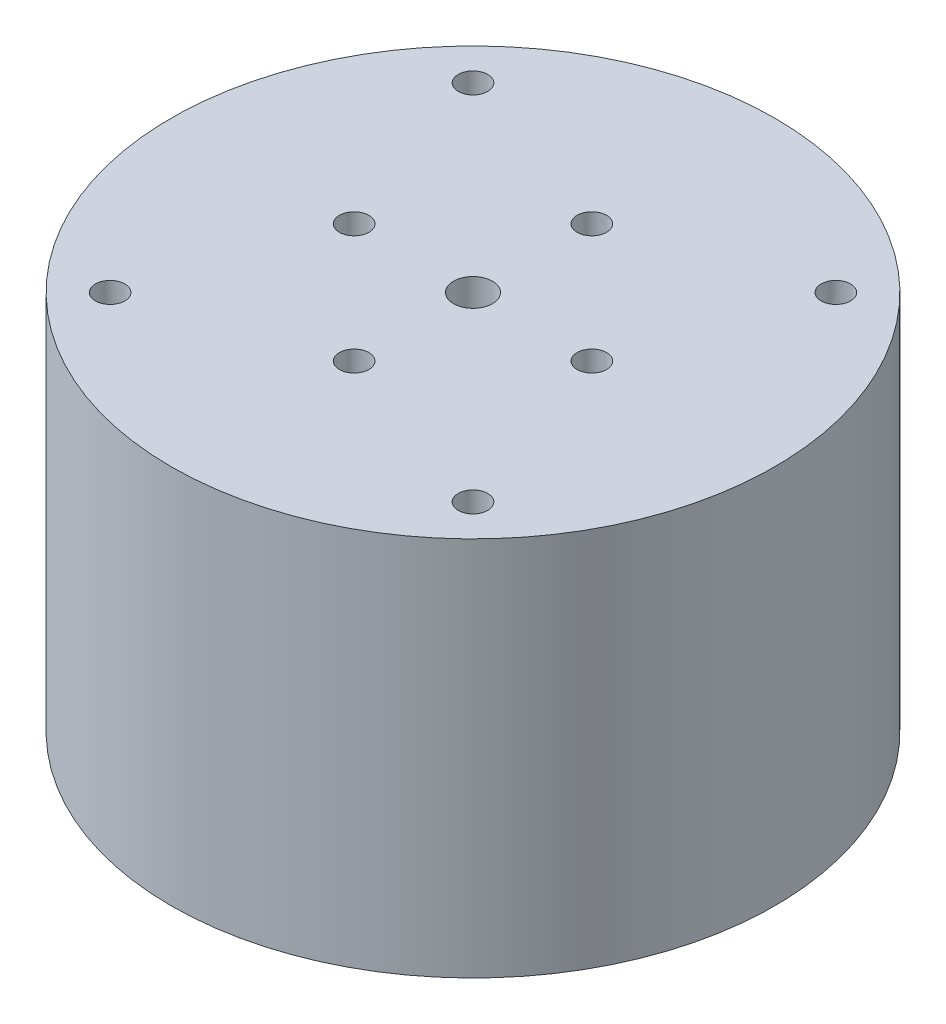
ISO-10303-21;
HEADER;
FILE_DESCRIPTION(('STEP AP214'),'2;1');
FILE_NAME('part.step','',(''),(''),'','','');
FILE_SCHEMA(('AUTOMOTIVE_DESIGN { 1 0 10303 214 1 1 1 1 }'));
ENDSEC;
DATA;
#1=APPLICATION_CONTEXT('core data for automotive mechanical design processes');
#2=APPLICATION_PROTOCOL_DEFINITION('international standard','automotive_design',2000,#1);
#3=PRODUCT_CONTEXT('',#1,'mechanical');
#4=PRODUCT('Part','Part','',(#3));
#5=PRODUCT_RELATED_PRODUCT_CATEGORY('part','',(#4));
#6=PRODUCT_DEFINITION_FORMATION('','',#4);
#7=PRODUCT_DEFINITION_CONTEXT('part definition',#1,'design');
#8=PRODUCT_DEFINITION('design','',#6,#7);
#9=PRODUCT_DEFINITION_SHAPE('','',#8);
#10=(LENGTH_UNIT() NAMED_UNIT(*) SI_UNIT(.MILLI.,.METRE.));
#11=(NAMED_UNIT(*) PLANE_ANGLE_UNIT() SI_UNIT($,.RADIAN.));
#12=(NAMED_UNIT(*) SI_UNIT($,.STERADIAN.) SOLID_ANGLE_UNIT());
#13=UNCERTAINTY_MEASURE_WITH_UNIT(LENGTH_MEASURE(1.E-05),#10,'distance_accuracy_value','');
#14=(GEOMETRIC_REPRESENTATION_CONTEXT(3) GLOBAL_UNCERTAINTY_ASSIGNED_CONTEXT((#13)) GLOBAL_UNIT_ASSIGNED_CONTEXT((#10,
#11,#12)) REPRESENTATION_CONTEXT('',''));
#15=CARTESIAN_POINT('',(0.,0.,0.));
#16=DIRECTION('',(0.,0.,1.));
#17=DIRECTION('',(1.,0.,0.));
#18=AXIS2_PLACEMENT_3D('',#15,#16,#17);
#19=CARTESIAN_POINT('',(0.,40.,0.));
#20=DIRECTION('',(0.,-1.,0.));
#21=DIRECTION('',(0.,0.,-1.));
#22=AXIS2_PLACEMENT_3D('',#19,#20,#21);
#23=CYLINDRICAL_SURFACE('',#22,2.05);
#24=CARTESIAN_POINT('',(0.,40.,0.));
#25=DIRECTION('',(0.,1.,0.));
#26=DIRECTION('',(0.,0.,1.));
#27=AXIS2_PLACEMENT_3D('',#24,#25,#26);
#28=CIRCLE('',#27,2.05);
#29=CARTESIAN_POINT('',(0.,40.,2.05));
#30=VERTEX_POINT('',#29);
#31=EDGE_CURVE('E44',#30,#30,#28,.T.);
#32=ORIENTED_EDGE('',*,*,#31,.T.);
#33=EDGE_LOOP('',(#32));
#34=FACE_BOUND('',#33,.T.);
#35=CARTESIAN_POINT('',(0.,30.,0.));
#36=DIRECTION('',(0.,-1.,0.));
#37=DIRECTION('',(0.,0.,-1.));
#38=AXIS2_PLACEMENT_3D('',#35,#36,#37);
#39=CIRCLE('',#38,2.05);
#40=CARTESIAN_POINT('',(0.,30.,-2.05));
#41=VERTEX_POINT('',#40);
#42=EDGE_CURVE('E35',#41,#41,#39,.T.);
#43=ORIENTED_EDGE('',*,*,#42,.T.);
#44=EDGE_LOOP('',(#43));
#45=FACE_BOUND('',#44,.T.);
#46=ADVANCED_FACE('F31',(#34,#45),#23,.F.);
#47=CARTESIAN_POINT('',(0.,40.,0.));
#48=DIRECTION('',(0.,1.,0.));
#49=DIRECTION('',(0.,0.,1.));
#50=AXIS2_PLACEMENT_3D('',#47,#48,#49);
#51=PLANE('',#50);
#52=CARTESIAN_POINT('',(-19.0830442572703,40.,19.0830442572725));
#53=DIRECTION('',(0.,1.,0.));
#54=DIRECTION('',(0.,0.,1.));
#55=AXIS2_PLACEMENT_3D('',#52,#53,#54);
#56=CIRCLE('',#55,1.55000000000235);
#57=CARTESIAN_POINT('',(-19.0830442572703,40.,20.6330442572748));
#58=VERTEX_POINT('',#57);
#59=EDGE_CURVE('E82',#58,#58,#56,.T.);
#60=ORIENTED_EDGE('',*,*,#59,.F.);
#61=EDGE_LOOP('',(#60));
#62=FACE_BOUND('',#61,.T.);
#63=CARTESIAN_POINT('',(19.0830442572726,40.,-19.0830442572725));
#64=DIRECTION('',(0.,1.,0.));
#65=DIRECTION('',(0.,0.,1.));
#66=AXIS2_PLACEMENT_3D('',#63,#64,#65);
#67=CIRCLE('',#66,1.55000000000013);
#68=CARTESIAN_POINT('',(19.0830442572726,40.,-17.5330442572723));
#69=VERTEX_POINT('',#68);
#70=EDGE_CURVE('E70',#69,#69,#67,.T.);
#71=ORIENTED_EDGE('',*,*,#70,.F.);
#72=EDGE_LOOP('',(#71));
#73=FACE_BOUND('',#72,.T.);
#74=CARTESIAN_POINT('',(7.07481118762232E-13,40.,12.5));
#75=DIRECTION('',(0.,1.,0.));
#76=DIRECTION('',(0.,0.,1.));
#77=AXIS2_PLACEMENT_3D('',#74,#75,#76);
#78=CIRCLE('',#77,1.55000000000076);
#79=CARTESIAN_POINT('',(7.07481118762232E-13,40.,14.0500000000008));
#80=VERTEX_POINT('',#79);
#81=EDGE_CURVE('E58',#80,#80,#78,.T.);
#82=ORIENTED_EDGE('',*,*,#81,.F.);
#83=EDGE_LOOP('',(#82));
#84=FACE_BOUND('',#83,.T.);
#85=CARTESIAN_POINT('',(0.,40.,-12.5));
#86=DIRECTION('',(0.,1.,0.));
#87=DIRECTION('',(0.,0.,1.));
#88=AXIS2_PLACEMENT_3D('',#85,#86,#87);
#89=CIRCLE('',#88,1.55);
#90=CARTESIAN_POINT('',(0.,40.,-10.95));
#91=VERTEX_POINT('',#90);
#92=EDGE_CURVE('E48',#91,#91,#89,.T.);
#93=ORIENTED_EDGE('',*,*,#92,.F.);
#94=EDGE_LOOP('',(#93));
#95=FACE_BOUND('',#94,.T.);
#96=CARTESIAN_POINT('',(0.,40.,0.));
#97=DIRECTION('',(0.,1.,0.));
#98=DIRECTION('',(0.,0.,1.));
#99=AXIS2_PLACEMENT_3D('',#96,#97,#98);
#100=CIRCLE('',#99,31.75);
#101=CARTESIAN_POINT('',(0.,40.,31.75));
#102=VERTEX_POINT('',#101);
#103=EDGE_CURVE('E10',#102,#102,#100,.T.);
#104=ORIENTED_EDGE('',*,*,#103,.T.);
#105=EDGE_LOOP('',(#104));
#106=FACE_BOUND('',#105,.T.);
#107=ORIENTED_EDGE('',*,*,#31,.F.);
#108=EDGE_LOOP('',(#107));
#109=FACE_BOUND('',#108,.T.);
#110=CARTESIAN_POINT('',(12.5000000000004,40.,-3.53740559381116E-13));
#111=DIRECTION('',(0.,1.,0.));
#112=DIRECTION('',(0.,0.,1.));
#113=AXIS2_PLACEMENT_3D('',#110,#111,#112);
#114=CIRCLE('',#113,1.55000000000028);
#115=CARTESIAN_POINT('',(12.5000000000004,40.,1.54999999999992));
#116=VERTEX_POINT('',#115);
#117=EDGE_CURVE('E52',#116,#116,#114,.T.);
#118=ORIENTED_EDGE('',*,*,#117,.F.);
#119=EDGE_LOOP('',(#118));
#120=FACE_BOUND('',#119,.T.);
#121=CARTESIAN_POINT('',(-12.4999999999996,40.,3.5527136788005E-13));
#122=DIRECTION('',(0.,1.,0.));
#123=DIRECTION('',(0.,0.,1.));
#124=AXIS2_PLACEMENT_3D('',#121,#122,#123);
#125=CIRCLE('',#124,1.55000000000057);
#126=CARTESIAN_POINT('',(-12.4999999999996,40.,1.55000000000092));
#127=VERTEX_POINT('',#126);
#128=EDGE_CURVE('E64',#127,#127,#125,.T.);
#129=ORIENTED_EDGE('',*,*,#128,.F.);
#130=EDGE_LOOP('',(#129));
#131=FACE_BOUND('',#130,.T.);
#132=CARTESIAN_POINT('',(19.0830442572736,40.,19.0830442572714));
#133=DIRECTION('',(0.,1.,0.));
#134=DIRECTION('',(0.,0.,1.));
#135=AXIS2_PLACEMENT_3D('',#132,#133,#134);
#136=CIRCLE('',#135,1.55000000000178);
#137=CARTESIAN_POINT('',(19.0830442572736,40.,20.6330442572732));
#138=VERTEX_POINT('',#137);
#139=EDGE_CURVE('E76',#138,#138,#136,.T.);
#140=ORIENTED_EDGE('',*,*,#139,.F.);
#141=EDGE_LOOP('',(#140));
#142=FACE_BOUND('',#141,.T.);
#143=CARTESIAN_POINT('',(-19.0830442572713,40.,-19.0830442572714));
#144=DIRECTION('',(0.,1.,0.));
#145=DIRECTION('',(0.,0.,1.));
#146=AXIS2_PLACEMENT_3D('',#143,#144,#145);
#147=CIRCLE('',#146,1.55000000000088);
#148=CARTESIAN_POINT('',(-19.0830442572713,40.,-17.5330442572706));
#149=VERTEX_POINT('',#148);
#150=EDGE_CURVE('E88',#149,#149,#147,.T.);
#151=ORIENTED_EDGE('',*,*,#150,.F.);
#152=EDGE_LOOP('',(#151));
#153=FACE_BOUND('',#152,.T.);
#154=ADVANCED_FACE('F118',(#62,#73,#84,#95,#106,#109,#120,#131,#142,#153),#51,.T.);
#155=CARTESIAN_POINT('',(0.,0.,0.));
#156=DIRECTION('',(0.,1.,0.));
#157=DIRECTION('',(0.,0.,1.));
#158=AXIS2_PLACEMENT_3D('',#155,#156,#157);
#159=PLANE('',#158);
#160=CARTESIAN_POINT('',(0.,0.,0.));
#161=DIRECTION('',(0.,-1.,0.));
#162=DIRECTION('',(0.,0.,-1.));
#163=AXIS2_PLACEMENT_3D('',#160,#161,#162);
#164=CIRCLE('',#163,6.5);
#165=CARTESIAN_POINT('',(0.,0.,-6.5));
#166=VERTEX_POINT('',#165);
#167=EDGE_CURVE('E96',#166,#166,#164,.T.);
#168=ORIENTED_EDGE('',*,*,#167,.F.);
#169=EDGE_LOOP('',(#168));
#170=FACE_BOUND('',#169,.T.);
#171=CARTESIAN_POINT('',(-19.0830442572703,0.,19.0830442572725));
#172=DIRECTION('',(0.,1.,0.));
#173=DIRECTION('',(0.,0.,1.));
#174=AXIS2_PLACEMENT_3D('',#171,#172,#173);
#175=CIRCLE('',#174,1.55000000000235);
#176=CARTESIAN_POINT('',(-19.0830442572703,0.,20.6330442572748));
#177=VERTEX_POINT('',#176);
#178=EDGE_CURVE('E85',#177,#177,#175,.T.);
#179=ORIENTED_EDGE('',*,*,#178,.T.);
#180=EDGE_LOOP('',(#179));
#181=FACE_BOUND('',#180,.T.);
#182=CARTESIAN_POINT('',(19.0830442572726,0.,-19.0830442572725));
#183=DIRECTION('',(0.,1.,0.));
#184=DIRECTION('',(0.,0.,1.));
#185=AXIS2_PLACEMENT_3D('',#182,#183,#184);
#186=CIRCLE('',#185,1.55000000000013);
#187=CARTESIAN_POINT('',(19.0830442572726,0.,-17.5330442572723));
#188=VERTEX_POINT('',#187);
#189=EDGE_CURVE('E73',#188,#188,#186,.T.);
#190=ORIENTED_EDGE('',*,*,#189,.T.);
#191=EDGE_LOOP('',(#190));
#192=FACE_BOUND('',#191,.T.);
#193=CARTESIAN_POINT('',(7.07481118762232E-13,0.,12.5));
#194=DIRECTION('',(0.,1.,0.));
#195=DIRECTION('',(0.,0.,1.));
#196=AXIS2_PLACEMENT_3D('',#193,#194,#195);
#197=CIRCLE('',#196,1.55000000000076);
#198=CARTESIAN_POINT('',(7.07481118762232E-13,0.,14.0500000000008));
#199=VERTEX_POINT('',#198);
#200=EDGE_CURVE('E61',#199,#199,#197,.T.);
#201=ORIENTED_EDGE('',*,*,#200,.T.);
#202=EDGE_LOOP('',(#201));
#203=FACE_BOUND('',#202,.T.);
#204=CARTESIAN_POINT('',(0.,0.,-12.5));
#205=DIRECTION('',(0.,1.,0.));
#206=DIRECTION('',(0.,0.,1.));
#207=AXIS2_PLACEMENT_3D('',#204,#205,#206);
#208=CIRCLE('',#207,1.55);
#209=CARTESIAN_POINT('',(0.,0.,-10.95));
#210=VERTEX_POINT('',#209);
#211=EDGE_CURVE('E49',#210,#210,#208,.T.);
#212=ORIENTED_EDGE('',*,*,#211,.T.);
#213=EDGE_LOOP('',(#212));
#214=FACE_BOUND('',#213,.T.);
#215=CARTESIAN_POINT('',(0.,0.,0.));
#216=DIRECTION('',(0.,1.,0.));
#217=DIRECTION('',(0.,0.,1.));
#218=AXIS2_PLACEMENT_3D('',#215,#216,#217);
#219=CIRCLE('',#218,31.75);
#220=CARTESIAN_POINT('',(0.,0.,31.75));
#221=VERTEX_POINT('',#220);
#222=EDGE_CURVE('E39',#221,#221,#219,.T.);
#223=ORIENTED_EDGE('',*,*,#222,.F.);
#224=EDGE_LOOP('',(#223));
#225=FACE_BOUND('',#224,.T.);
#226=CARTESIAN_POINT('',(12.5000000000004,0.,-3.53740559381116E-13));
#227=DIRECTION('',(0.,1.,0.));
#228=DIRECTION('',(0.,0.,1.));
#229=AXIS2_PLACEMENT_3D('',#226,#227,#228);
#230=CIRCLE('',#229,1.55000000000028);
#231=CARTESIAN_POINT('',(12.5000000000004,0.,1.54999999999992));
#232=VERTEX_POINT('',#231);
#233=EDGE_CURVE('E55',#232,#232,#230,.T.);
#234=ORIENTED_EDGE('',*,*,#233,.T.);
#235=EDGE_LOOP('',(#234));
#236=FACE_BOUND('',#235,.T.);
#237=CARTESIAN_POINT('',(-12.4999999999996,0.,3.5527136788005E-13));
#238=DIRECTION('',(0.,1.,0.));
#239=DIRECTION('',(0.,0.,1.));
#240=AXIS2_PLACEMENT_3D('',#237,#238,#239);
#241=CIRCLE('',#240,1.55000000000057);
#242=CARTESIAN_POINT('',(-12.4999999999996,0.,1.55000000000092));
#243=VERTEX_POINT('',#242);
#244=EDGE_CURVE('E67',#243,#243,#241,.T.);
#245=ORIENTED_EDGE('',*,*,#244,.T.);
#246=EDGE_LOOP('',(#245));
#247=FACE_BOUND('',#246,.T.);
#248=CARTESIAN_POINT('',(19.0830442572736,0.,19.0830442572714));
#249=DIRECTION('',(0.,1.,0.));
#250=DIRECTION('',(0.,0.,1.));
#251=AXIS2_PLACEMENT_3D('',#248,#249,#250);
#252=CIRCLE('',#251,1.55000000000178);
#253=CARTESIAN_POINT('',(19.0830442572736,0.,20.6330442572732));
#254=VERTEX_POINT('',#253);
#255=EDGE_CURVE('E79',#254,#254,#252,.T.);
#256=ORIENTED_EDGE('',*,*,#255,.T.);
#257=EDGE_LOOP('',(#256));
#258=FACE_BOUND('',#257,.T.);
#259=CARTESIAN_POINT('',(-19.0830442572713,0.,-19.0830442572714));
#260=DIRECTION('',(0.,1.,0.));
#261=DIRECTION('',(0.,0.,1.));
#262=AXIS2_PLACEMENT_3D('',#259,#260,#261);
#263=CIRCLE('',#262,1.55000000000088);
#264=CARTESIAN_POINT('',(-19.0830442572713,0.,-17.5330442572706));
#265=VERTEX_POINT('',#264);
#266=EDGE_CURVE('E91',#265,#265,#263,.T.);
#267=ORIENTED_EDGE('',*,*,#266,.T.);
#268=EDGE_LOOP('',(#267));
#269=FACE_BOUND('',#268,.T.);
#270=ADVANCED_FACE('F124',(#170,#181,#192,#203,#214,#225,#236,#247,#258,#269),#159,.F.);
#271=CARTESIAN_POINT('',(0.,40.,0.));
#272=DIRECTION('',(0.,-1.,0.));
#273=DIRECTION('',(0.,0.,-1.));
#274=AXIS2_PLACEMENT_3D('',#271,#272,#273);
#275=CYLINDRICAL_SURFACE('',#274,31.75);
#276=ORIENTED_EDGE('',*,*,#103,.F.);
#277=EDGE_LOOP('',(#276));
#278=FACE_BOUND('',#277,.T.);
#279=ORIENTED_EDGE('',*,*,#222,.T.);
#280=EDGE_LOOP('',(#279));
#281=FACE_BOUND('',#280,.T.);
#282=ADVANCED_FACE('F33',(#278,#281),#275,.T.);
#283=CARTESIAN_POINT('',(0.,40.,-12.5));
#284=DIRECTION('',(0.,-1.,0.));
#285=DIRECTION('',(0.,0.,-1.));
#286=AXIS2_PLACEMENT_3D('',#283,#284,#285);
#287=CYLINDRICAL_SURFACE('',#286,1.55);
#288=ORIENTED_EDGE('',*,*,#92,.T.);
#289=EDGE_LOOP('',(#288));
#290=FACE_BOUND('',#289,.T.);
#291=ORIENTED_EDGE('',*,*,#211,.F.);
#292=EDGE_LOOP('',(#291));
#293=FACE_BOUND('',#292,.T.);
#294=ADVANCED_FACE('F128',(#290,#293),#287,.F.);
#295=CARTESIAN_POINT('',(12.5000000000004,40.,-3.53740559381116E-13));
#296=DIRECTION('',(0.,-1.,0.));
#297=DIRECTION('',(0.,0.,-1.));
#298=AXIS2_PLACEMENT_3D('',#295,#296,#297);
#299=CYLINDRICAL_SURFACE('',#298,1.55000000000028);
#300=ORIENTED_EDGE('',*,*,#117,.T.);
#301=EDGE_LOOP('',(#300));
#302=FACE_BOUND('',#301,.T.);
#303=ORIENTED_EDGE('',*,*,#233,.F.);
#304=EDGE_LOOP('',(#303));
#305=FACE_BOUND('',#304,.T.);
#306=ADVANCED_FACE('F180',(#302,#305),#299,.F.);
#307=CARTESIAN_POINT('',(7.07481118762232E-13,40.,12.5));
#308=DIRECTION('',(0.,-1.,0.));
#309=DIRECTION('',(0.,0.,-1.));
#310=AXIS2_PLACEMENT_3D('',#307,#308,#309);
#311=CYLINDRICAL_SURFACE('',#310,1.55000000000076);
#312=ORIENTED_EDGE('',*,*,#81,.T.);
#313=EDGE_LOOP('',(#312));
#314=FACE_BOUND('',#313,.T.);
#315=ORIENTED_EDGE('',*,*,#200,.F.);
#316=EDGE_LOOP('',(#315));
#317=FACE_BOUND('',#316,.T.);
#318=ADVANCED_FACE('F177',(#314,#317),#311,.F.);
#319=CARTESIAN_POINT('',(-12.4999999999996,40.,3.5527136788005E-13));
#320=DIRECTION('',(0.,-1.,0.));
#321=DIRECTION('',(0.,0.,-1.));
#322=AXIS2_PLACEMENT_3D('',#319,#320,#321);
#323=CYLINDRICAL_SURFACE('',#322,1.55000000000057);
#324=ORIENTED_EDGE('',*,*,#128,.T.);
#325=EDGE_LOOP('',(#324));
#326=FACE_BOUND('',#325,.T.);
#327=ORIENTED_EDGE('',*,*,#244,.F.);
#328=EDGE_LOOP('',(#327));
#329=FACE_BOUND('',#328,.T.);
#330=ADVANCED_FACE('F173',(#326,#329),#323,.F.);
#331=CARTESIAN_POINT('',(19.0830442572726,40.,-19.0830442572725));
#332=DIRECTION('',(0.,-1.,0.));
#333=DIRECTION('',(0.,0.,-1.));
#334=AXIS2_PLACEMENT_3D('',#331,#332,#333);
#335=CYLINDRICAL_SURFACE('',#334,1.55000000000013);
#336=ORIENTED_EDGE('',*,*,#70,.T.);
#337=EDGE_LOOP('',(#336));
#338=FACE_BOUND('',#337,.T.);
#339=ORIENTED_EDGE('',*,*,#189,.F.);
#340=EDGE_LOOP('',(#339));
#341=FACE_BOUND('',#340,.T.);
#342=ADVANCED_FACE('F169',(#338,#341),#335,.F.);
#343=CARTESIAN_POINT('',(19.0830442572736,40.,19.0830442572714));
#344=DIRECTION('',(0.,-1.,0.));
#345=DIRECTION('',(0.,0.,-1.));
#346=AXIS2_PLACEMENT_3D('',#343,#344,#345);
#347=CYLINDRICAL_SURFACE('',#346,1.55000000000178);
#348=ORIENTED_EDGE('',*,*,#139,.T.);
#349=EDGE_LOOP('',(#348));
#350=FACE_BOUND('',#349,.T.);
#351=ORIENTED_EDGE('',*,*,#255,.F.);
#352=EDGE_LOOP('',(#351));
#353=FACE_BOUND('',#352,.T.);
#354=ADVANCED_FACE('F163',(#350,#353),#347,.F.);
#355=CARTESIAN_POINT('',(-19.0830442572703,40.,19.0830442572725));
#356=DIRECTION('',(0.,-1.,0.));
#357=DIRECTION('',(0.,0.,-1.));
#358=AXIS2_PLACEMENT_3D('',#355,#356,#357);
#359=CYLINDRICAL_SURFACE('',#358,1.55000000000235);
#360=ORIENTED_EDGE('',*,*,#59,.T.);
#361=EDGE_LOOP('',(#360));
#362=FACE_BOUND('',#361,.T.);
#363=ORIENTED_EDGE('',*,*,#178,.F.);
#364=EDGE_LOOP('',(#363));
#365=FACE_BOUND('',#364,.T.);
#366=ADVANCED_FACE('F157',(#362,#365),#359,.F.);
#367=CARTESIAN_POINT('',(-19.0830442572713,40.,-19.0830442572714));
#368=DIRECTION('',(0.,-1.,0.));
#369=DIRECTION('',(0.,0.,-1.));
#370=AXIS2_PLACEMENT_3D('',#367,#368,#369);
#371=CYLINDRICAL_SURFACE('',#370,1.55000000000088);
#372=ORIENTED_EDGE('',*,*,#150,.T.);
#373=EDGE_LOOP('',(#372));
#374=FACE_BOUND('',#373,.T.);
#375=ORIENTED_EDGE('',*,*,#266,.F.);
#376=EDGE_LOOP('',(#375));
#377=FACE_BOUND('',#376,.T.);
#378=ADVANCED_FACE('F114',(#374,#377),#371,.F.);
#379=CARTESIAN_POINT('',(0.,30.,0.));
#380=DIRECTION('',(0.,-1.,0.));
#381=DIRECTION('',(0.,0.,-1.));
#382=AXIS2_PLACEMENT_3D('',#379,#380,#381);
#383=CYLINDRICAL_SURFACE('',#382,6.5);
#384=CARTESIAN_POINT('',(0.,30.,0.));
#385=DIRECTION('',(0.,-1.,0.));
#386=DIRECTION('',(0.,0.,-1.));
#387=AXIS2_PLACEMENT_3D('',#384,#385,#386);
#388=CIRCLE('',#387,6.5);
#389=CARTESIAN_POINT('',(0.,30.,-6.5));
#390=VERTEX_POINT('',#389);
#391=EDGE_CURVE('E99',#390,#390,#388,.T.);
#392=ORIENTED_EDGE('',*,*,#391,.F.);
#393=EDGE_LOOP('',(#392));
#394=FACE_BOUND('',#393,.T.);
#395=ORIENTED_EDGE('',*,*,#167,.T.);
#396=EDGE_LOOP('',(#395));
#397=FACE_BOUND('',#396,.T.);
#398=ADVANCED_FACE('F109',(#394,#397),#383,.F.);
#399=CARTESIAN_POINT('',(0.,30.,0.));
#400=DIRECTION('',(0.,-1.,0.));
#401=DIRECTION('',(0.,0.,-1.));
#402=AXIS2_PLACEMENT_3D('',#399,#400,#401);
#403=PLANE('',#402);
#404=ORIENTED_EDGE('',*,*,#42,.F.);
#405=EDGE_LOOP('',(#404));
#406=FACE_BOUND('',#405,.T.);
#407=ORIENTED_EDGE('',*,*,#391,.T.);
#408=EDGE_LOOP('',(#407));
#409=FACE_BOUND('',#408,.T.);
#410=ADVANCED_FACE('F107',(#406,#409),#403,.T.);
#411=CLOSED_SHELL('',(#46,#154,#270,#282,#294,#306,#318,#330,#342,#354,#366,#378,#398,#410));
#412=MANIFOLD_SOLID_BREP('B2',#411);
#413=ADVANCED_BREP_SHAPE_REPRESENTATION('',(#18,#412),#14);
#414=SHAPE_DEFINITION_REPRESENTATION(#9,#413);
ENDSEC;
END-ISO-10303-21;
